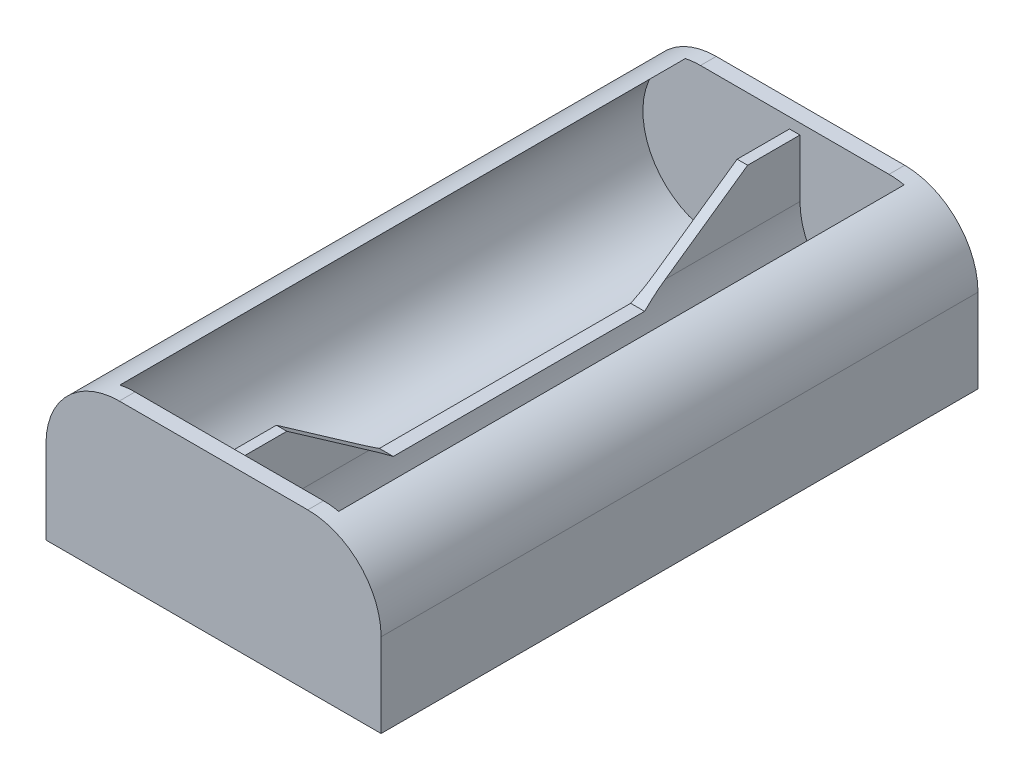
ISO-10303-21;
HEADER;
FILE_DESCRIPTION(('STEP AP214'),'2;1');
FILE_NAME('part.step','',(''),(''),'','','');
FILE_SCHEMA(('AUTOMOTIVE_DESIGN { 1 0 10303 214 1 1 1 1 }'));
ENDSEC;
DATA;
#1=APPLICATION_CONTEXT('core data for automotive mechanical design processes');
#2=APPLICATION_PROTOCOL_DEFINITION('international standard','automotive_design',2000,#1);
#3=PRODUCT_CONTEXT('',#1,'mechanical');
#4=PRODUCT('Part','Part','',(#3));
#5=PRODUCT_RELATED_PRODUCT_CATEGORY('part','',(#4));
#6=PRODUCT_DEFINITION_FORMATION('','',#4);
#7=PRODUCT_DEFINITION_CONTEXT('part definition',#1,'design');
#8=PRODUCT_DEFINITION('design','',#6,#7);
#9=PRODUCT_DEFINITION_SHAPE('','',#8);
#10=(LENGTH_UNIT() NAMED_UNIT(*) SI_UNIT(.MILLI.,.METRE.));
#11=(NAMED_UNIT(*) PLANE_ANGLE_UNIT() SI_UNIT($,.RADIAN.));
#12=(NAMED_UNIT(*) SI_UNIT($,.STERADIAN.) SOLID_ANGLE_UNIT());
#13=UNCERTAINTY_MEASURE_WITH_UNIT(LENGTH_MEASURE(1.E-05),#10,'distance_accuracy_value','');
#14=(GEOMETRIC_REPRESENTATION_CONTEXT(3) GLOBAL_UNCERTAINTY_ASSIGNED_CONTEXT((#13)) GLOBAL_UNIT_ASSIGNED_CONTEXT((#10,
#11,#12)) REPRESENTATION_CONTEXT('',''));
#15=CARTESIAN_POINT('',(0.,0.,0.));
#16=DIRECTION('',(0.,0.,1.));
#17=DIRECTION('',(1.,0.,0.));
#18=AXIS2_PLACEMENT_3D('',#15,#16,#17);
#19=CARTESIAN_POINT('',(8.50000000000001,8.5,1.49999999999999));
#20=DIRECTION('',(0.,0.,1.));
#21=DIRECTION('',(1.,0.,0.));
#22=AXIS2_PLACEMENT_3D('',#19,#20,#21);
#23=CYLINDRICAL_SURFACE('',#22,7.);
#24=CARTESIAN_POINT('',(8.50000000000001,8.5,14.3571428571428));
#25=DIRECTION('',(0.,0.81923192051904,0.573462344363328));
#26=DIRECTION('',(0.,-0.573462344363328,0.81923192051904));
#27=AXIS2_PLACEMENT_3D('',#24,#25,#26);
#28=ELLIPSE('',#27,12.2065556157337,7.);
#29=CARTESIAN_POINT('',(15.5,8.49999999999995,14.3571428571429));
#30=VERTEX_POINT('',#29);
#31=CARTESIAN_POINT('',(15.3373971655887,7.,16.5));
#32=VERTEX_POINT('',#31);
#33=EDGE_CURVE('E252',#30,#32,#28,.F.);
#34=ORIENTED_EDGE('',*,*,#33,.F.);
#35=DIRECTION('',(0.,0.,1.));
#36=VECTOR('',#35,1.);
#37=CARTESIAN_POINT('',(15.5,8.49999999999995,1.49999999999999));
#38=LINE('',#37,#36);
#39=CARTESIAN_POINT('',(15.5,8.49999999999995,1.49999999999999));
#40=VERTEX_POINT('',#39);
#41=EDGE_CURVE('E279',#40,#30,#38,.T.);
#42=ORIENTED_EDGE('',*,*,#41,.F.);
#43=CARTESIAN_POINT('',(8.50000000000001,8.5,1.49999999999999));
#44=DIRECTION('',(0.,0.,1.));
#45=DIRECTION('',(1.,0.,0.));
#46=AXIS2_PLACEMENT_3D('',#43,#44,#45);
#47=CIRCLE('',#46,7.);
#48=CARTESIAN_POINT('',(5.55056825520774,14.8482952343768,1.49999999999999));
#49=VERTEX_POINT('',#48);
#50=EDGE_CURVE('E285',#49,#40,#47,.T.);
#51=ORIENTED_EDGE('',*,*,#50,.F.);
#52=DIRECTION('',(0.,0.,1.));
#53=VECTOR('',#52,1.);
#54=CARTESIAN_POINT('',(5.55056825520774,14.8482952343768,1.49999999999999));
#55=LINE('',#54,#53);
#56=CARTESIAN_POINT('',(5.55056825520773,14.8482952343768,55.5));
#57=VERTEX_POINT('',#56);
#58=EDGE_CURVE('E304',#49,#57,#55,.T.);
#59=ORIENTED_EDGE('',*,*,#58,.T.);
#60=CARTESIAN_POINT('',(8.50000000000001,8.5,55.5));
#61=DIRECTION('',(0.,0.,1.));
#62=DIRECTION('',(1.,0.,0.));
#63=AXIS2_PLACEMENT_3D('',#60,#61,#62);
#64=CIRCLE('',#63,7.);
#65=CARTESIAN_POINT('',(15.5,8.49999999999995,55.5));
#66=VERTEX_POINT('',#65);
#67=EDGE_CURVE('E282',#57,#66,#64,.T.);
#68=ORIENTED_EDGE('',*,*,#67,.T.);
#69=CARTESIAN_POINT('',(15.5,8.49999999999996,42.6428571428571));
#70=VERTEX_POINT('',#69);
#71=EDGE_CURVE('E276',#70,#66,#38,.T.);
#72=ORIENTED_EDGE('',*,*,#71,.F.);
#73=CARTESIAN_POINT('',(8.50000000000001,8.5,42.6428571428571));
#74=DIRECTION('',(0.,0.81923192051904,-0.573462344363328));
#75=DIRECTION('',(0.,0.573462344363328,0.81923192051904));
#76=AXIS2_PLACEMENT_3D('',#73,#74,#75);
#77=ELLIPSE('',#76,12.2065556157337,7.);
#78=CARTESIAN_POINT('',(15.3373971655887,7.,40.5));
#79=VERTEX_POINT('',#78);
#80=EDGE_CURVE('E247',#79,#70,#77,.F.);
#81=ORIENTED_EDGE('',*,*,#80,.F.);
#82=DIRECTION('',(0.,0.,1.));
#83=VECTOR('',#82,1.);
#84=CARTESIAN_POINT('',(15.3373971655887,7.,1.49999999999999));
#85=LINE('',#84,#83);
#86=EDGE_CURVE('E249',#32,#79,#85,.T.);
#87=ORIENTED_EDGE('',*,*,#86,.F.);
#88=EDGE_LOOP('',(#34,#42,#51,#59,#68,#72,#81,#87));
#89=FACE_BOUND('',#88,.T.);
#90=ADVANCED_FACE('F50',(#89),#23,.F.);
#91=CARTESIAN_POINT('',(15.5,8.49999999999995,1.49999999999999));
#92=DIRECTION('',(1.,0.,0.));
#93=DIRECTION('',(0.,0.,-1.));
#94=AXIS2_PLACEMENT_3D('',#91,#92,#93);
#95=PLANE('',#94);
#96=ORIENTED_EDGE('',*,*,#41,.T.);
#97=DIRECTION('',(0.,-0.573462344363328,0.81923192051904));
#98=VECTOR('',#97,1.);
#99=CARTESIAN_POINT('',(15.5,14.,6.49999999999999));
#100=LINE('',#99,#98);
#101=CARTESIAN_POINT('',(15.5,14.,6.49999999999999));
#102=VERTEX_POINT('',#101);
#103=EDGE_CURVE('E255',#102,#30,#100,.T.);
#104=ORIENTED_EDGE('',*,*,#103,.F.);
#105=DIRECTION('',(0.,0.,1.));
#106=VECTOR('',#105,1.);
#107=CARTESIAN_POINT('',(15.5,14.,1.49999999999999));
#108=LINE('',#107,#106);
#109=CARTESIAN_POINT('',(15.5,14.,1.49999999999999));
#110=VERTEX_POINT('',#109);
#111=EDGE_CURVE('E269',#110,#102,#108,.T.);
#112=ORIENTED_EDGE('',*,*,#111,.F.);
#113=DIRECTION('',(0.,1.,0.));
#114=VECTOR('',#113,1.);
#115=CARTESIAN_POINT('',(15.5,8.49999999999995,1.49999999999999));
#116=LINE('',#115,#114);
#117=EDGE_CURVE('E273',#40,#110,#116,.T.);
#118=ORIENTED_EDGE('',*,*,#117,.F.);
#119=EDGE_LOOP('',(#96,#104,#112,#118));
#120=FACE_BOUND('',#119,.T.);
#121=ADVANCED_FACE('F403',(#120),#95,.F.);
#122=CARTESIAN_POINT('',(0.,14.,1.49999999999999));
#123=DIRECTION('',(0.,-1.,0.));
#124=DIRECTION('',(0.,0.,-1.));
#125=AXIS2_PLACEMENT_3D('',#122,#123,#124);
#126=PLANE('',#125);
#127=DIRECTION('',(1.,0.,0.));
#128=VECTOR('',#127,1.);
#129=CARTESIAN_POINT('',(0.,14.,6.49999999999999));
#130=LINE('',#129,#128);
#131=CARTESIAN_POINT('',(16.5,14.,6.49999999999999));
#132=VERTEX_POINT('',#131);
#133=EDGE_CURVE('E13',#102,#132,#130,.T.);
#134=ORIENTED_EDGE('',*,*,#133,.T.);
#135=DIRECTION('',(0.,0.,1.));
#136=VECTOR('',#135,1.);
#137=CARTESIAN_POINT('',(16.5,14.,1.49999999999999));
#138=LINE('',#137,#136);
#139=CARTESIAN_POINT('',(16.5,14.,1.49999999999999));
#140=VERTEX_POINT('',#139);
#141=EDGE_CURVE('E371',#140,#132,#138,.T.);
#142=ORIENTED_EDGE('',*,*,#141,.F.);
#143=DIRECTION('',(1.,0.,0.));
#144=VECTOR('',#143,1.);
#145=CARTESIAN_POINT('',(0.,14.,1.49999999999999));
#146=LINE('',#145,#144);
#147=EDGE_CURVE('E265',#110,#140,#146,.T.);
#148=ORIENTED_EDGE('',*,*,#147,.F.);
#149=ORIENTED_EDGE('',*,*,#111,.T.);
#150=EDGE_LOOP('',(#134,#142,#148,#149));
#151=FACE_BOUND('',#150,.T.);
#152=ADVANCED_FACE('F406',(#151),#126,.F.);
#153=CARTESIAN_POINT('',(0.,15.,0.));
#154=DIRECTION('',(0.,1.,0.));
#155=DIRECTION('',(0.,0.,1.));
#156=AXIS2_PLACEMENT_3D('',#153,#154,#155);
#157=PLANE('',#156);
#158=DIRECTION('',(-1.,0.,0.));
#159=VECTOR('',#158,1.);
#160=CARTESIAN_POINT('',(0.,15.,1.49999999999999));
#161=LINE('',#160,#159);
#162=CARTESIAN_POINT('',(25.,15.,1.49999999999999));
#163=VERTEX_POINT('',#162);
#164=CARTESIAN_POINT('',(7.,15.,1.49999999999999));
#165=VERTEX_POINT('',#164);
#166=EDGE_CURVE('E283',#163,#165,#161,.T.);
#167=ORIENTED_EDGE('',*,*,#166,.F.);
#168=DIRECTION('',(0.,0.,1.));
#169=VECTOR('',#168,1.);
#170=CARTESIAN_POINT('',(25.,15.,0.));
#171=LINE('',#170,#169);
#172=CARTESIAN_POINT('',(25.,15.,0.));
#173=VERTEX_POINT('',#172);
#174=EDGE_CURVE('E217',#173,#163,#171,.T.);
#175=ORIENTED_EDGE('',*,*,#174,.F.);
#176=DIRECTION('',(-1.,0.,0.));
#177=VECTOR('',#176,1.);
#178=CARTESIAN_POINT('',(47.,15.,0.));
#179=LINE('',#178,#177);
#180=CARTESIAN_POINT('',(7.,15.,0.));
#181=VERTEX_POINT('',#180);
#182=EDGE_CURVE('E290',#173,#181,#179,.T.);
#183=ORIENTED_EDGE('',*,*,#182,.T.);
#184=DIRECTION('',(0.,0.,1.));
#185=VECTOR('',#184,1.);
#186=CARTESIAN_POINT('',(7.,15.,0.));
#187=LINE('',#186,#185);
#188=EDGE_CURVE('E298',#181,#165,#187,.T.);
#189=ORIENTED_EDGE('',*,*,#188,.T.);
#190=EDGE_LOOP('',(#167,#175,#183,#189));
#191=FACE_BOUND('',#190,.T.);
#192=ADVANCED_FACE('F315',(#191),#157,.T.);
#193=CARTESIAN_POINT('',(7.,8.,0.));
#194=DIRECTION('',(0.,0.,-1.));
#195=DIRECTION('',(-1.,0.,0.));
#196=AXIS2_PLACEMENT_3D('',#193,#194,#195);
#197=CYLINDRICAL_SURFACE('',#196,7.);
#198=ORIENTED_EDGE('',*,*,#188,.F.);
#199=CARTESIAN_POINT('',(7.,8.,0.));
#200=DIRECTION('',(0.,0.,1.));
#201=DIRECTION('',(1.,0.,0.));
#202=AXIS2_PLACEMENT_3D('',#199,#200,#201);
#203=CIRCLE('',#202,7.);
#204=CARTESIAN_POINT('',(0.,8.,0.));
#205=VERTEX_POINT('',#204);
#206=EDGE_CURVE('E72',#205,#181,#203,.F.);
#207=ORIENTED_EDGE('',*,*,#206,.F.);
#208=DIRECTION('',(0.,0.,1.));
#209=VECTOR('',#208,1.);
#210=CARTESIAN_POINT('',(0.,8.,0.));
#211=LINE('',#210,#209);
#212=CARTESIAN_POINT('',(0.,8.,57.));
#213=VERTEX_POINT('',#212);
#214=EDGE_CURVE('E307',#213,#205,#211,.F.);
#215=ORIENTED_EDGE('',*,*,#214,.F.);
#216=CARTESIAN_POINT('',(7.,8.,57.));
#217=DIRECTION('',(0.,0.,1.));
#218=DIRECTION('',(1.,0.,0.));
#219=AXIS2_PLACEMENT_3D('',#216,#217,#218);
#220=CIRCLE('',#219,7.);
#221=CARTESIAN_POINT('',(7.,15.,57.));
#222=VERTEX_POINT('',#221);
#223=EDGE_CURVE('E239',#222,#213,#220,.T.);
#224=ORIENTED_EDGE('',*,*,#223,.F.);
#225=DIRECTION('',(0.,0.,-1.));
#226=VECTOR('',#225,1.);
#227=CARTESIAN_POINT('',(7.,15.,57.));
#228=LINE('',#227,#226);
#229=CARTESIAN_POINT('',(7.,15.,55.5));
#230=VERTEX_POINT('',#229);
#231=EDGE_CURVE('E241',#222,#230,#228,.T.);
#232=ORIENTED_EDGE('',*,*,#231,.T.);
#233=CARTESIAN_POINT('',(7.,8.,55.5));
#234=DIRECTION('',(0.,0.,1.));
#235=DIRECTION('',(1.,0.,0.));
#236=AXIS2_PLACEMENT_3D('',#233,#234,#235);
#237=CIRCLE('',#236,7.);
#238=EDGE_CURVE('E236',#230,#57,#237,.T.);
#239=ORIENTED_EDGE('',*,*,#238,.T.);
#240=ORIENTED_EDGE('',*,*,#58,.F.);
#241=CARTESIAN_POINT('',(7.,8.,1.49999999999999));
#242=DIRECTION('',(0.,0.,1.));
#243=DIRECTION('',(1.,0.,0.));
#244=AXIS2_PLACEMENT_3D('',#241,#242,#243);
#245=CIRCLE('',#244,7.);
#246=EDGE_CURVE('E301',#165,#49,#245,.T.);
#247=ORIENTED_EDGE('',*,*,#246,.F.);
#248=EDGE_LOOP('',(#198,#207,#215,#224,#232,#239,#240,#247));
#249=FACE_BOUND('',#248,.T.);
#250=ADVANCED_FACE('F52',(#249),#197,.T.);
#251=CARTESIAN_POINT('',(47.,15.,0.));
#252=DIRECTION('',(0.,0.,1.));
#253=DIRECTION('',(1.,0.,0.));
#254=AXIS2_PLACEMENT_3D('',#251,#252,#253);
#255=PLANE('',#254);
#256=ORIENTED_EDGE('',*,*,#182,.F.);
#257=CARTESIAN_POINT('',(25.,8.,0.));
#258=DIRECTION('',(0.,0.,-1.));
#259=DIRECTION('',(-1.,0.,0.));
#260=AXIS2_PLACEMENT_3D('',#257,#258,#259);
#261=CIRCLE('',#260,7.);
#262=CARTESIAN_POINT('',(32.,8.,0.));
#263=VERTEX_POINT('',#262);
#264=EDGE_CURVE('E232',#263,#173,#261,.F.);
#265=ORIENTED_EDGE('',*,*,#264,.F.);
#266=DIRECTION('',(0.,-1.,0.));
#267=VECTOR('',#266,1.);
#268=CARTESIAN_POINT('',(32.,15.,0.));
#269=LINE('',#268,#267);
#270=CARTESIAN_POINT('',(32.,0.,0.));
#271=VERTEX_POINT('',#270);
#272=EDGE_CURVE('E214',#263,#271,#269,.T.);
#273=ORIENTED_EDGE('',*,*,#272,.T.);
#274=DIRECTION('',(-1.,0.,0.));
#275=VECTOR('',#274,1.);
#276=CARTESIAN_POINT('',(47.,0.,0.));
#277=LINE('',#276,#275);
#278=CARTESIAN_POINT('',(0.,0.,0.));
#279=VERTEX_POINT('',#278);
#280=EDGE_CURVE('E213',#271,#279,#277,.T.);
#281=ORIENTED_EDGE('',*,*,#280,.T.);
#282=DIRECTION('',(0.,-1.,0.));
#283=VECTOR('',#282,1.);
#284=CARTESIAN_POINT('',(0.,15.,0.));
#285=LINE('',#284,#283);
#286=EDGE_CURVE('E292',#205,#279,#285,.T.);
#287=ORIENTED_EDGE('',*,*,#286,.F.);
#288=ORIENTED_EDGE('',*,*,#206,.T.);
#289=EDGE_LOOP('',(#256,#265,#273,#281,#287,#288));
#290=FACE_BOUND('',#289,.T.);
#291=ADVANCED_FACE('F311',(#290),#255,.F.);
#292=CARTESIAN_POINT('',(0.,15.,0.));
#293=DIRECTION('',(1.,0.,0.));
#294=DIRECTION('',(0.,0.,-1.));
#295=AXIS2_PLACEMENT_3D('',#292,#293,#294);
#296=PLANE('',#295);
#297=DIRECTION('',(0.,0.,1.));
#298=VECTOR('',#297,1.);
#299=CARTESIAN_POINT('',(0.,0.,0.));
#300=LINE('',#299,#298);
#301=CARTESIAN_POINT('',(0.,0.,57.));
#302=VERTEX_POINT('',#301);
#303=EDGE_CURVE('E293',#279,#302,#300,.T.);
#304=ORIENTED_EDGE('',*,*,#303,.T.);
#305=DIRECTION('',(0.,-1.,0.));
#306=VECTOR('',#305,1.);
#307=CARTESIAN_POINT('',(0.,8.,57.));
#308=LINE('',#307,#306);
#309=EDGE_CURVE('E195',#213,#302,#308,.T.);
#310=ORIENTED_EDGE('',*,*,#309,.F.);
#311=ORIENTED_EDGE('',*,*,#214,.T.);
#312=ORIENTED_EDGE('',*,*,#286,.T.);
#313=EDGE_LOOP('',(#304,#310,#311,#312));
#314=FACE_BOUND('',#313,.T.);
#315=ADVANCED_FACE('F322',(#314),#296,.F.);
#316=CARTESIAN_POINT('',(0.,0.,0.));
#317=DIRECTION('',(0.,1.,0.));
#318=DIRECTION('',(0.,0.,1.));
#319=AXIS2_PLACEMENT_3D('',#316,#317,#318);
#320=PLANE('',#319);
#321=ORIENTED_EDGE('',*,*,#280,.F.);
#322=DIRECTION('',(0.,0.,1.));
#323=VECTOR('',#322,1.);
#324=CARTESIAN_POINT('',(32.,0.,0.));
#325=LINE('',#324,#323);
#326=CARTESIAN_POINT('',(32.,0.,57.));
#327=VERTEX_POINT('',#326);
#328=EDGE_CURVE('E204',#271,#327,#325,.T.);
#329=ORIENTED_EDGE('',*,*,#328,.T.);
#330=DIRECTION('',(1.,0.,0.));
#331=VECTOR('',#330,1.);
#332=CARTESIAN_POINT('',(0.,0.,57.));
#333=LINE('',#332,#331);
#334=EDGE_CURVE('E187',#302,#327,#333,.T.);
#335=ORIENTED_EDGE('',*,*,#334,.F.);
#336=ORIENTED_EDGE('',*,*,#303,.F.);
#337=EDGE_LOOP('',(#321,#329,#335,#336));
#338=FACE_BOUND('',#337,.T.);
#339=ADVANCED_FACE('F212',(#338),#320,.F.);
#340=CARTESIAN_POINT('',(0.,0.,1.49999999999999));
#341=DIRECTION('',(0.,0.,1.));
#342=DIRECTION('',(1.,0.,0.));
#343=AXIS2_PLACEMENT_3D('',#340,#341,#342);
#344=PLANE('',#343);
#345=ORIENTED_EDGE('',*,*,#147,.T.);
#346=DIRECTION('',(0.,1.,0.));
#347=VECTOR('',#346,1.);
#348=CARTESIAN_POINT('',(16.5,8.49999999999995,1.49999999999999));
#349=LINE('',#348,#347);
#350=CARTESIAN_POINT('',(16.5,8.49999999999995,1.49999999999999));
#351=VERTEX_POINT('',#350);
#352=EDGE_CURVE('E342',#351,#140,#349,.T.);
#353=ORIENTED_EDGE('',*,*,#352,.F.);
#354=CARTESIAN_POINT('',(23.5,8.5,1.49999999999999));
#355=DIRECTION('',(0.,0.,-1.));
#356=DIRECTION('',(-1.,0.,0.));
#357=AXIS2_PLACEMENT_3D('',#354,#355,#356);
#358=CIRCLE('',#357,7.);
#359=CARTESIAN_POINT('',(26.4494317447923,14.8482952343768,1.49999999999999));
#360=VERTEX_POINT('',#359);
#361=EDGE_CURVE('E215',#360,#351,#358,.T.);
#362=ORIENTED_EDGE('',*,*,#361,.F.);
#363=CARTESIAN_POINT('',(25.,8.,1.49999999999999));
#364=DIRECTION('',(0.,0.,-1.));
#365=DIRECTION('',(-1.,0.,0.));
#366=AXIS2_PLACEMENT_3D('',#363,#364,#365);
#367=CIRCLE('',#366,7.);
#368=EDGE_CURVE('E226',#163,#360,#367,.T.);
#369=ORIENTED_EDGE('',*,*,#368,.F.);
#370=ORIENTED_EDGE('',*,*,#166,.T.);
#371=ORIENTED_EDGE('',*,*,#246,.T.);
#372=ORIENTED_EDGE('',*,*,#50,.T.);
#373=ORIENTED_EDGE('',*,*,#117,.T.);
#374=EDGE_LOOP('',(#345,#353,#362,#369,#370,#371,#372,#373));
#375=FACE_BOUND('',#374,.T.);
#376=ADVANCED_FACE('F339',(#375),#344,.T.);
#377=CARTESIAN_POINT('',(15.5,14.,50.5));
#378=VERTEX_POINT('',#377);
#379=CARTESIAN_POINT('',(15.5,14.,55.5));
#380=VERTEX_POINT('',#379);
#381=EDGE_CURVE('E267',#378,#380,#108,.T.);
#382=ORIENTED_EDGE('',*,*,#381,.F.);
#383=DIRECTION('',(0.,0.573462344363328,0.81923192051904));
#384=VECTOR('',#383,1.);
#385=CARTESIAN_POINT('',(15.5,14.,50.5));
#386=LINE('',#385,#384);
#387=EDGE_CURVE('E258',#70,#378,#386,.T.);
#388=ORIENTED_EDGE('',*,*,#387,.F.);
#389=ORIENTED_EDGE('',*,*,#71,.T.);
#390=DIRECTION('',(0.,1.,0.));
#391=VECTOR('',#390,1.);
#392=CARTESIAN_POINT('',(15.5,8.49999999999995,55.5));
#393=LINE('',#392,#391);
#394=EDGE_CURVE('E272',#66,#380,#393,.T.);
#395=ORIENTED_EDGE('',*,*,#394,.T.);
#396=EDGE_LOOP('',(#382,#388,#389,#395));
#397=FACE_BOUND('',#396,.T.);
#398=ADVANCED_FACE('F390',(#397),#95,.F.);
#399=DIRECTION('',(1.,0.,0.));
#400=VECTOR('',#399,1.);
#401=CARTESIAN_POINT('',(0.,14.,55.5));
#402=LINE('',#401,#400);
#403=CARTESIAN_POINT('',(16.5,14.,55.5));
#404=VERTEX_POINT('',#403);
#405=EDGE_CURVE('E263',#380,#404,#402,.T.);
#406=ORIENTED_EDGE('',*,*,#405,.T.);
#407=CARTESIAN_POINT('',(16.5,14.,50.5));
#408=VERTEX_POINT('',#407);
#409=EDGE_CURVE('E370',#408,#404,#138,.T.);
#410=ORIENTED_EDGE('',*,*,#409,.F.);
#411=DIRECTION('',(-1.,0.,0.));
#412=VECTOR('',#411,1.);
#413=CARTESIAN_POINT('',(0.,14.,50.5));
#414=LINE('',#413,#412);
#415=EDGE_CURVE('E58',#408,#378,#414,.T.);
#416=ORIENTED_EDGE('',*,*,#415,.T.);
#417=ORIENTED_EDGE('',*,*,#381,.T.);
#418=EDGE_LOOP('',(#406,#410,#416,#417));
#419=FACE_BOUND('',#418,.T.);
#420=ADVANCED_FACE('F387',(#419),#126,.F.);
#421=CARTESIAN_POINT('',(35.5,14.,6.49999999999999));
#422=DIRECTION('',(0.,-0.81923192051904,-0.573462344363328));
#423=DIRECTION('',(0.,0.573462344363328,-0.81923192051904));
#424=AXIS2_PLACEMENT_3D('',#421,#422,#423);
#425=PLANE('',#424);
#426=DIRECTION('',(-1.,0.,0.));
#427=VECTOR('',#426,1.);
#428=CARTESIAN_POINT('',(35.5,7.,16.5));
#429=LINE('',#428,#427);
#430=CARTESIAN_POINT('',(16.6626028344113,7.,16.5));
#431=VERTEX_POINT('',#430);
#432=EDGE_CURVE('E260',#431,#32,#429,.T.);
#433=ORIENTED_EDGE('',*,*,#432,.F.);
#434=CARTESIAN_POINT('',(23.5,8.5,14.3571428571428));
#435=DIRECTION('',(0.,-0.81923192051904,-0.573462344363328));
#436=DIRECTION('',(0.,-0.573462344363328,0.81923192051904));
#437=AXIS2_PLACEMENT_3D('',#434,#435,#436);
#438=ELLIPSE('',#437,12.2065556157337,7.);
#439=CARTESIAN_POINT('',(16.5,8.49999999999995,14.3571428571429));
#440=VERTEX_POINT('',#439);
#441=EDGE_CURVE('E363',#440,#431,#438,.F.);
#442=ORIENTED_EDGE('',*,*,#441,.F.);
#443=DIRECTION('',(0.,-0.573462344363328,0.81923192051904));
#444=VECTOR('',#443,1.);
#445=CARTESIAN_POINT('',(16.5,14.,6.49999999999999));
#446=LINE('',#445,#444);
#447=EDGE_CURVE('E365',#132,#440,#446,.T.);
#448=ORIENTED_EDGE('',*,*,#447,.F.);
#449=ORIENTED_EDGE('',*,*,#133,.F.);
#450=ORIENTED_EDGE('',*,*,#103,.T.);
#451=ORIENTED_EDGE('',*,*,#33,.T.);
#452=EDGE_LOOP('',(#433,#442,#448,#449,#450,#451));
#453=FACE_BOUND('',#452,.T.);
#454=ADVANCED_FACE('F398',(#453),#425,.F.);
#455=CARTESIAN_POINT('',(35.5,14.,50.5));
#456=DIRECTION('',(0.,-0.81923192051904,0.573462344363328));
#457=DIRECTION('',(0.,-0.573462344363328,-0.81923192051904));
#458=AXIS2_PLACEMENT_3D('',#455,#456,#457);
#459=PLANE('',#458);
#460=ORIENTED_EDGE('',*,*,#415,.F.);
#461=DIRECTION('',(0.,0.573462344363328,0.81923192051904));
#462=VECTOR('',#461,1.);
#463=CARTESIAN_POINT('',(16.5,14.,50.5));
#464=LINE('',#463,#462);
#465=CARTESIAN_POINT('',(16.5,8.49999999999996,42.6428571428571));
#466=VERTEX_POINT('',#465);
#467=EDGE_CURVE('E367',#466,#408,#464,.T.);
#468=ORIENTED_EDGE('',*,*,#467,.F.);
#469=CARTESIAN_POINT('',(23.5,8.5,42.6428571428571));
#470=DIRECTION('',(0.,-0.81923192051904,0.573462344363328));
#471=DIRECTION('',(0.,0.573462344363328,0.81923192051904));
#472=AXIS2_PLACEMENT_3D('',#469,#470,#471);
#473=ELLIPSE('',#472,12.2065556157337,7.);
#474=CARTESIAN_POINT('',(16.6626028344113,7.,40.5));
#475=VERTEX_POINT('',#474);
#476=EDGE_CURVE('E357',#475,#466,#473,.F.);
#477=ORIENTED_EDGE('',*,*,#476,.F.);
#478=DIRECTION('',(-1.,0.,0.));
#479=VECTOR('',#478,1.);
#480=CARTESIAN_POINT('',(35.5,7.,40.5));
#481=LINE('',#480,#479);
#482=EDGE_CURVE('E261',#475,#79,#481,.T.);
#483=ORIENTED_EDGE('',*,*,#482,.T.);
#484=ORIENTED_EDGE('',*,*,#80,.T.);
#485=ORIENTED_EDGE('',*,*,#387,.T.);
#486=EDGE_LOOP('',(#460,#468,#477,#483,#484,#485));
#487=FACE_BOUND('',#486,.T.);
#488=ADVANCED_FACE('F392',(#487),#459,.F.);
#489=CARTESIAN_POINT('',(35.5,7.,40.5));
#490=DIRECTION('',(0.,-1.,0.));
#491=DIRECTION('',(0.,0.,-1.));
#492=AXIS2_PLACEMENT_3D('',#489,#490,#491);
#493=PLANE('',#492);
#494=ORIENTED_EDGE('',*,*,#482,.F.);
#495=DIRECTION('',(0.,0.,1.));
#496=VECTOR('',#495,1.);
#497=CARTESIAN_POINT('',(16.6626028344113,7.,1.49999999999999));
#498=LINE('',#497,#496);
#499=EDGE_CURVE('E360',#431,#475,#498,.T.);
#500=ORIENTED_EDGE('',*,*,#499,.F.);
#501=ORIENTED_EDGE('',*,*,#432,.T.);
#502=ORIENTED_EDGE('',*,*,#86,.T.);
#503=EDGE_LOOP('',(#494,#500,#501,#502));
#504=FACE_BOUND('',#503,.T.);
#505=ADVANCED_FACE('F395',(#504),#493,.F.);
#506=CARTESIAN_POINT('',(40.,8.,55.5));
#507=DIRECTION('',(0.,0.,1.));
#508=DIRECTION('',(1.,0.,0.));
#509=AXIS2_PLACEMENT_3D('',#506,#507,#508);
#510=PLANE('',#509);
#511=DIRECTION('',(-1.,0.,0.));
#512=VECTOR('',#511,1.);
#513=CARTESIAN_POINT('',(40.,15.,55.5));
#514=LINE('',#513,#512);
#515=CARTESIAN_POINT('',(25.,15.,55.5));
#516=VERTEX_POINT('',#515);
#517=EDGE_CURVE('E235',#516,#230,#514,.T.);
#518=ORIENTED_EDGE('',*,*,#517,.F.);
#519=CARTESIAN_POINT('',(25.,8.,55.5));
#520=DIRECTION('',(0.,0.,-1.));
#521=DIRECTION('',(-1.,0.,0.));
#522=AXIS2_PLACEMENT_3D('',#519,#520,#521);
#523=CIRCLE('',#522,7.);
#524=CARTESIAN_POINT('',(26.4494317447923,14.8482952343768,55.5));
#525=VERTEX_POINT('',#524);
#526=EDGE_CURVE('E210',#516,#525,#523,.T.);
#527=ORIENTED_EDGE('',*,*,#526,.T.);
#528=CARTESIAN_POINT('',(23.5,8.5,55.5));
#529=DIRECTION('',(0.,0.,-1.));
#530=DIRECTION('',(-1.,0.,0.));
#531=AXIS2_PLACEMENT_3D('',#528,#529,#530);
#532=CIRCLE('',#531,7.);
#533=CARTESIAN_POINT('',(16.5,8.49999999999995,55.5));
#534=VERTEX_POINT('',#533);
#535=EDGE_CURVE('E220',#525,#534,#532,.T.);
#536=ORIENTED_EDGE('',*,*,#535,.T.);
#537=DIRECTION('',(0.,1.,0.));
#538=VECTOR('',#537,1.);
#539=CARTESIAN_POINT('',(16.5,8.49999999999995,55.5));
#540=LINE('',#539,#538);
#541=EDGE_CURVE('E374',#534,#404,#540,.T.);
#542=ORIENTED_EDGE('',*,*,#541,.T.);
#543=ORIENTED_EDGE('',*,*,#405,.F.);
#544=ORIENTED_EDGE('',*,*,#394,.F.);
#545=ORIENTED_EDGE('',*,*,#67,.F.);
#546=ORIENTED_EDGE('',*,*,#238,.F.);
#547=EDGE_LOOP('',(#518,#527,#536,#542,#543,#544,#545,#546));
#548=FACE_BOUND('',#547,.T.);
#549=ADVANCED_FACE('F331',(#548),#510,.F.);
#550=CARTESIAN_POINT('',(40.,15.,57.));
#551=DIRECTION('',(0.,-1.,0.));
#552=DIRECTION('',(0.,0.,-1.));
#553=AXIS2_PLACEMENT_3D('',#550,#551,#552);
#554=PLANE('',#553);
#555=DIRECTION('',(-1.,0.,0.));
#556=VECTOR('',#555,1.);
#557=CARTESIAN_POINT('',(40.,15.,57.));
#558=LINE('',#557,#556);
#559=CARTESIAN_POINT('',(25.,15.,57.));
#560=VERTEX_POINT('',#559);
#561=EDGE_CURVE('E199',#560,#222,#558,.T.);
#562=ORIENTED_EDGE('',*,*,#561,.F.);
#563=DIRECTION('',(0.,0.,-1.));
#564=VECTOR('',#563,1.);
#565=CARTESIAN_POINT('',(25.,15.,57.));
#566=LINE('',#565,#564);
#567=EDGE_CURVE('E352',#560,#516,#566,.T.);
#568=ORIENTED_EDGE('',*,*,#567,.T.);
#569=ORIENTED_EDGE('',*,*,#517,.T.);
#570=ORIENTED_EDGE('',*,*,#231,.F.);
#571=EDGE_LOOP('',(#562,#568,#569,#570));
#572=FACE_BOUND('',#571,.T.);
#573=ADVANCED_FACE('F328',(#572),#554,.F.);
#574=CARTESIAN_POINT('',(40.,8.,57.));
#575=DIRECTION('',(0.,0.,1.));
#576=DIRECTION('',(1.,0.,0.));
#577=AXIS2_PLACEMENT_3D('',#574,#575,#576);
#578=PLANE('',#577);
#579=ORIENTED_EDGE('',*,*,#334,.T.);
#580=DIRECTION('',(0.,-1.,0.));
#581=VECTOR('',#580,1.);
#582=CARTESIAN_POINT('',(32.,8.,57.));
#583=LINE('',#582,#581);
#584=CARTESIAN_POINT('',(32.,8.,57.));
#585=VERTEX_POINT('',#584);
#586=EDGE_CURVE('E191',#585,#327,#583,.T.);
#587=ORIENTED_EDGE('',*,*,#586,.F.);
#588=CARTESIAN_POINT('',(25.,8.,57.));
#589=DIRECTION('',(0.,0.,-1.));
#590=DIRECTION('',(-1.,0.,0.));
#591=AXIS2_PLACEMENT_3D('',#588,#589,#590);
#592=CIRCLE('',#591,7.);
#593=EDGE_CURVE('E209',#560,#585,#592,.T.);
#594=ORIENTED_EDGE('',*,*,#593,.F.);
#595=ORIENTED_EDGE('',*,*,#561,.T.);
#596=ORIENTED_EDGE('',*,*,#223,.T.);
#597=ORIENTED_EDGE('',*,*,#309,.T.);
#598=EDGE_LOOP('',(#579,#587,#594,#595,#596,#597));
#599=FACE_BOUND('',#598,.T.);
#600=ADVANCED_FACE('F189',(#599),#578,.T.);
#601=CARTESIAN_POINT('',(23.5,8.5,1.49999999999999));
#602=DIRECTION('',(0.,0.,1.));
#603=DIRECTION('',(-1.,0.,0.));
#604=AXIS2_PLACEMENT_3D('',#601,#602,#603);
#605=CYLINDRICAL_SURFACE('',#604,7.);
#606=ORIENTED_EDGE('',*,*,#441,.T.);
#607=ORIENTED_EDGE('',*,*,#499,.T.);
#608=ORIENTED_EDGE('',*,*,#476,.T.);
#609=DIRECTION('',(0.,0.,1.));
#610=VECTOR('',#609,1.);
#611=CARTESIAN_POINT('',(16.5,8.49999999999995,1.49999999999999));
#612=LINE('',#611,#610);
#613=EDGE_CURVE('E376',#466,#534,#612,.T.);
#614=ORIENTED_EDGE('',*,*,#613,.T.);
#615=ORIENTED_EDGE('',*,*,#535,.F.);
#616=DIRECTION('',(0.,0.,1.));
#617=VECTOR('',#616,1.);
#618=CARTESIAN_POINT('',(26.4494317447923,14.8482952343768,1.49999999999999));
#619=LINE('',#618,#617);
#620=EDGE_CURVE('E228',#360,#525,#619,.T.);
#621=ORIENTED_EDGE('',*,*,#620,.F.);
#622=ORIENTED_EDGE('',*,*,#361,.T.);
#623=EDGE_CURVE('E379',#351,#440,#612,.T.);
#624=ORIENTED_EDGE('',*,*,#623,.T.);
#625=EDGE_LOOP('',(#606,#607,#608,#614,#615,#621,#622,#624));
#626=FACE_BOUND('',#625,.T.);
#627=ADVANCED_FACE('F348',(#626),#605,.F.);
#628=CARTESIAN_POINT('',(16.5,8.49999999999995,1.49999999999999));
#629=DIRECTION('',(-1.,0.,0.));
#630=DIRECTION('',(0.,0.,-1.));
#631=AXIS2_PLACEMENT_3D('',#628,#629,#630);
#632=PLANE('',#631);
#633=ORIENTED_EDGE('',*,*,#623,.F.);
#634=ORIENTED_EDGE('',*,*,#352,.T.);
#635=ORIENTED_EDGE('',*,*,#141,.T.);
#636=ORIENTED_EDGE('',*,*,#447,.T.);
#637=EDGE_LOOP('',(#633,#634,#635,#636));
#638=FACE_BOUND('',#637,.T.);
#639=ADVANCED_FACE('F408',(#638),#632,.F.);
#640=CARTESIAN_POINT('',(25.,8.,0.));
#641=DIRECTION('',(0.,0.,-1.));
#642=DIRECTION('',(1.,0.,0.));
#643=AXIS2_PLACEMENT_3D('',#640,#641,#642);
#644=CYLINDRICAL_SURFACE('',#643,7.);
#645=ORIENTED_EDGE('',*,*,#174,.T.);
#646=ORIENTED_EDGE('',*,*,#368,.T.);
#647=ORIENTED_EDGE('',*,*,#620,.T.);
#648=ORIENTED_EDGE('',*,*,#526,.F.);
#649=ORIENTED_EDGE('',*,*,#567,.F.);
#650=ORIENTED_EDGE('',*,*,#593,.T.);
#651=DIRECTION('',(0.,0.,1.));
#652=VECTOR('',#651,1.);
#653=CARTESIAN_POINT('',(32.,8.,0.));
#654=LINE('',#653,#652);
#655=EDGE_CURVE('E207',#585,#263,#654,.F.);
#656=ORIENTED_EDGE('',*,*,#655,.T.);
#657=ORIENTED_EDGE('',*,*,#264,.T.);
#658=EDGE_LOOP('',(#645,#646,#647,#648,#649,#650,#656,#657));
#659=FACE_BOUND('',#658,.T.);
#660=ADVANCED_FACE('F319',(#659),#644,.T.);
#661=CARTESIAN_POINT('',(32.,15.,0.));
#662=DIRECTION('',(-1.,0.,0.));
#663=DIRECTION('',(0.,0.,-1.));
#664=AXIS2_PLACEMENT_3D('',#661,#662,#663);
#665=PLANE('',#664);
#666=ORIENTED_EDGE('',*,*,#328,.F.);
#667=ORIENTED_EDGE('',*,*,#272,.F.);
#668=ORIENTED_EDGE('',*,*,#655,.F.);
#669=ORIENTED_EDGE('',*,*,#586,.T.);
#670=EDGE_LOOP('',(#666,#667,#668,#669));
#671=FACE_BOUND('',#670,.T.);
#672=ADVANCED_FACE('F203',(#671),#665,.F.);
#673=ORIENTED_EDGE('',*,*,#409,.T.);
#674=ORIENTED_EDGE('',*,*,#541,.F.);
#675=ORIENTED_EDGE('',*,*,#613,.F.);
#676=ORIENTED_EDGE('',*,*,#467,.T.);
#677=EDGE_LOOP('',(#673,#674,#675,#676));
#678=FACE_BOUND('',#677,.T.);
#679=ADVANCED_FACE('F385',(#678),#632,.F.);
#680=CLOSED_SHELL('',(#90,#121,#152,#192,#250,#291,#315,#339,#376,#398,#420,#454,#488,#505,#549,
#573,#600,#627,#639,#660,#672,#679));
#681=MANIFOLD_SOLID_BREP('B2',#680);
#682=ADVANCED_BREP_SHAPE_REPRESENTATION('',(#18,#681),#14);
#683=SHAPE_DEFINITION_REPRESENTATION(#9,#682);
ENDSEC;
END-ISO-10303-21;
